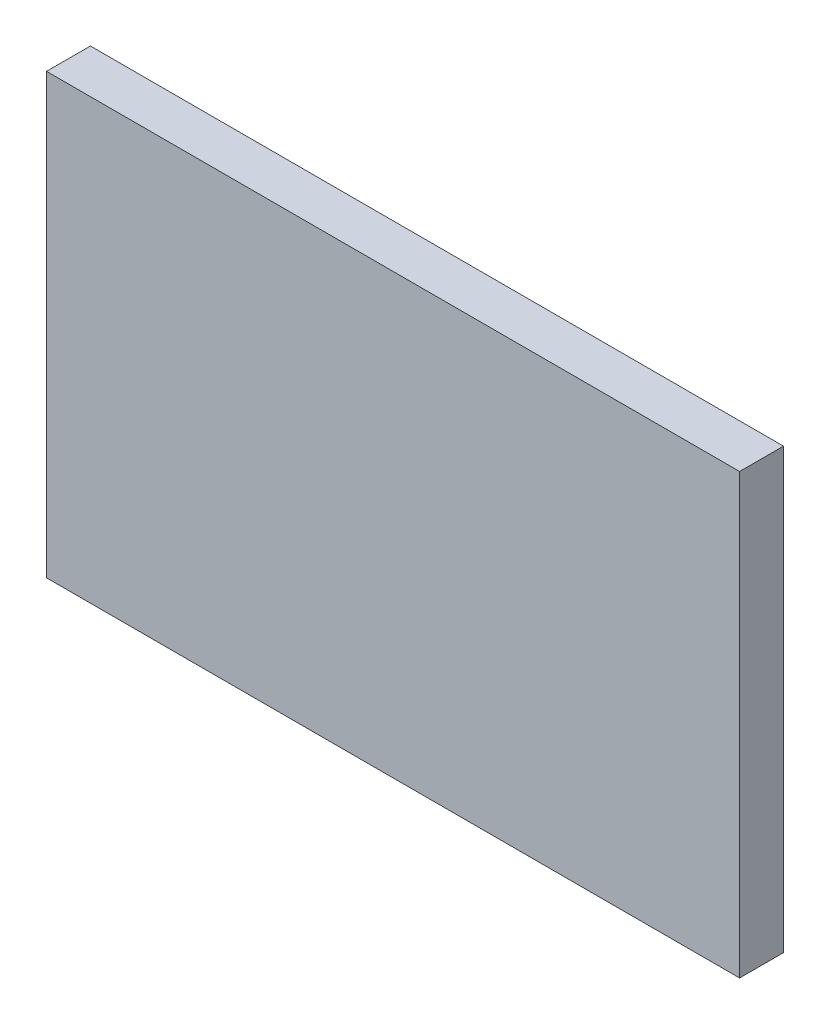
ISO-10303-21;
HEADER;
FILE_DESCRIPTION(('STEP AP214'),'2;1');
FILE_NAME('part.step','',(''),(''),'','','');
FILE_SCHEMA(('AUTOMOTIVE_DESIGN { 1 0 10303 214 1 1 1 1 }'));
ENDSEC;
DATA;
#1=APPLICATION_CONTEXT('core data for automotive mechanical design processes');
#2=APPLICATION_PROTOCOL_DEFINITION('international standard','automotive_design',2000,#1);
#3=PRODUCT_CONTEXT('',#1,'mechanical');
#4=PRODUCT('Part','Part','',(#3));
#5=PRODUCT_RELATED_PRODUCT_CATEGORY('part','',(#4));
#6=PRODUCT_DEFINITION_FORMATION('','',#4);
#7=PRODUCT_DEFINITION_CONTEXT('part definition',#1,'design');
#8=PRODUCT_DEFINITION('design','',#6,#7);
#9=PRODUCT_DEFINITION_SHAPE('','',#8);
#10=(LENGTH_UNIT() NAMED_UNIT(*) SI_UNIT(.MILLI.,.METRE.));
#11=(NAMED_UNIT(*) PLANE_ANGLE_UNIT() SI_UNIT($,.RADIAN.));
#12=(NAMED_UNIT(*) SI_UNIT($,.STERADIAN.) SOLID_ANGLE_UNIT());
#13=UNCERTAINTY_MEASURE_WITH_UNIT(LENGTH_MEASURE(1.E-05),#10,'distance_accuracy_value','');
#14=(GEOMETRIC_REPRESENTATION_CONTEXT(3) GLOBAL_UNCERTAINTY_ASSIGNED_CONTEXT((#13)) GLOBAL_UNIT_ASSIGNED_CONTEXT((#10,
#11,#12)) REPRESENTATION_CONTEXT('',''));
#15=CARTESIAN_POINT('',(0.,0.,0.));
#16=DIRECTION('',(0.,0.,1.));
#17=DIRECTION('',(1.,0.,0.));
#18=AXIS2_PLACEMENT_3D('',#15,#16,#17);
#19=CARTESIAN_POINT('',(0.,0.,100.));
#20=DIRECTION('',(1.,0.,0.));
#21=DIRECTION('',(0.,0.,-1.));
#22=AXIS2_PLACEMENT_3D('',#19,#20,#21);
#23=PLANE('',#22);
#24=DIRECTION('',(0.,-1.,0.));
#25=VECTOR('',#24,1.);
#26=CARTESIAN_POINT('',(0.,0.,0.));
#27=LINE('',#26,#25);
#28=CARTESIAN_POINT('',(0.,0.,0.));
#29=VERTEX_POINT('',#28);
#30=CARTESIAN_POINT('',(0.,-1000.,0.));
#31=VERTEX_POINT('',#30);
#32=EDGE_CURVE('E96',#29,#31,#27,.T.);
#33=ORIENTED_EDGE('',*,*,#32,.T.);
#34=DIRECTION('',(0.,0.,-1.));
#35=VECTOR('',#34,1.);
#36=CARTESIAN_POINT('',(0.,-1000.,100.));
#37=LINE('',#36,#35);
#38=CARTESIAN_POINT('',(0.,-1000.,100.));
#39=VERTEX_POINT('',#38);
#40=EDGE_CURVE('E11',#39,#31,#37,.T.);
#41=ORIENTED_EDGE('',*,*,#40,.F.);
#42=DIRECTION('',(0.,-1.,0.));
#43=VECTOR('',#42,1.);
#44=CARTESIAN_POINT('',(0.,0.,100.));
#45=LINE('',#44,#43);
#46=CARTESIAN_POINT('',(0.,0.,100.));
#47=VERTEX_POINT('',#46);
#48=EDGE_CURVE('E84',#47,#39,#45,.T.);
#49=ORIENTED_EDGE('',*,*,#48,.F.);
#50=DIRECTION('',(0.,0.,-1.));
#51=VECTOR('',#50,1.);
#52=CARTESIAN_POINT('',(0.,0.,100.));
#53=LINE('',#52,#51);
#54=EDGE_CURVE('E92',#47,#29,#53,.T.);
#55=ORIENTED_EDGE('',*,*,#54,.T.);
#56=EDGE_LOOP('',(#33,#41,#49,#55));
#57=FACE_BOUND('',#56,.T.);
#58=ADVANCED_FACE('F33',(#57),#23,.F.);
#59=CARTESIAN_POINT('',(0.,-1000.,100.));
#60=DIRECTION('',(0.,1.,0.));
#61=DIRECTION('',(0.,0.,1.));
#62=AXIS2_PLACEMENT_3D('',#59,#60,#61);
#63=PLANE('',#62);
#64=DIRECTION('',(1.,0.,0.));
#65=VECTOR('',#64,1.);
#66=CARTESIAN_POINT('',(0.,-1000.,0.));
#67=LINE('',#66,#65);
#68=CARTESIAN_POINT('',(1580.,-1000.,0.));
#69=VERTEX_POINT('',#68);
#70=EDGE_CURVE('E88',#31,#69,#67,.T.);
#71=ORIENTED_EDGE('',*,*,#70,.T.);
#72=DIRECTION('',(0.,0.,-1.));
#73=VECTOR('',#72,1.);
#74=CARTESIAN_POINT('',(1580.,-1000.,100.));
#75=LINE('',#74,#73);
#76=CARTESIAN_POINT('',(1580.,-1000.,100.));
#77=VERTEX_POINT('',#76);
#78=EDGE_CURVE('E41',#77,#69,#75,.T.);
#79=ORIENTED_EDGE('',*,*,#78,.F.);
#80=DIRECTION('',(1.,0.,0.));
#81=VECTOR('',#80,1.);
#82=CARTESIAN_POINT('',(0.,-1000.,100.));
#83=LINE('',#82,#81);
#84=EDGE_CURVE('E79',#39,#77,#83,.T.);
#85=ORIENTED_EDGE('',*,*,#84,.F.);
#86=ORIENTED_EDGE('',*,*,#40,.T.);
#87=EDGE_LOOP('',(#71,#79,#85,#86));
#88=FACE_BOUND('',#87,.T.);
#89=ADVANCED_FACE('F87',(#88),#63,.F.);
#90=CARTESIAN_POINT('',(1580.,0.,100.));
#91=DIRECTION('',(-1.,0.,0.));
#92=DIRECTION('',(0.,0.,1.));
#93=AXIS2_PLACEMENT_3D('',#90,#91,#92);
#94=PLANE('',#93);
#95=DIRECTION('',(0.,1.,0.));
#96=VECTOR('',#95,1.);
#97=CARTESIAN_POINT('',(1580.,0.,0.));
#98=LINE('',#97,#96);
#99=CARTESIAN_POINT('',(1580.,0.,0.));
#100=VERTEX_POINT('',#99);
#101=EDGE_CURVE('E66',#69,#100,#98,.T.);
#102=ORIENTED_EDGE('',*,*,#101,.T.);
#103=DIRECTION('',(0.,0.,-1.));
#104=VECTOR('',#103,1.);
#105=CARTESIAN_POINT('',(1580.,0.,100.));
#106=LINE('',#105,#104);
#107=CARTESIAN_POINT('',(1580.,0.,100.));
#108=VERTEX_POINT('',#107);
#109=EDGE_CURVE('E89',#108,#100,#106,.T.);
#110=ORIENTED_EDGE('',*,*,#109,.F.);
#111=DIRECTION('',(0.,1.,0.));
#112=VECTOR('',#111,1.);
#113=CARTESIAN_POINT('',(1580.,0.,100.));
#114=LINE('',#113,#112);
#115=EDGE_CURVE('E82',#77,#108,#114,.T.);
#116=ORIENTED_EDGE('',*,*,#115,.F.);
#117=ORIENTED_EDGE('',*,*,#78,.T.);
#118=EDGE_LOOP('',(#102,#110,#116,#117));
#119=FACE_BOUND('',#118,.T.);
#120=ADVANCED_FACE('F90',(#119),#94,.F.);
#121=CARTESIAN_POINT('',(0.,0.,100.));
#122=DIRECTION('',(0.,-1.,0.));
#123=DIRECTION('',(0.,0.,-1.));
#124=AXIS2_PLACEMENT_3D('',#121,#122,#123);
#125=PLANE('',#124);
#126=DIRECTION('',(-1.,0.,0.));
#127=VECTOR('',#126,1.);
#128=CARTESIAN_POINT('',(0.,0.,0.));
#129=LINE('',#128,#127);
#130=EDGE_CURVE('E72',#100,#29,#129,.T.);
#131=ORIENTED_EDGE('',*,*,#130,.T.);
#132=ORIENTED_EDGE('',*,*,#54,.F.);
#133=DIRECTION('',(-1.,0.,0.));
#134=VECTOR('',#133,1.);
#135=CARTESIAN_POINT('',(0.,0.,100.));
#136=LINE('',#135,#134);
#137=EDGE_CURVE('E49',#108,#47,#136,.T.);
#138=ORIENTED_EDGE('',*,*,#137,.F.);
#139=ORIENTED_EDGE('',*,*,#109,.T.);
#140=EDGE_LOOP('',(#131,#132,#138,#139));
#141=FACE_BOUND('',#140,.T.);
#142=ADVANCED_FACE('F103',(#141),#125,.F.);
#143=CARTESIAN_POINT('',(0.,0.,100.));
#144=DIRECTION('',(0.,0.,1.));
#145=DIRECTION('',(1.,0.,0.));
#146=AXIS2_PLACEMENT_3D('',#143,#144,#145);
#147=PLANE('',#146);
#148=ORIENTED_EDGE('',*,*,#48,.T.);
#149=ORIENTED_EDGE('',*,*,#84,.T.);
#150=ORIENTED_EDGE('',*,*,#115,.T.);
#151=ORIENTED_EDGE('',*,*,#137,.T.);
#152=EDGE_LOOP('',(#148,#149,#150,#151));
#153=FACE_BOUND('',#152,.T.);
#154=ADVANCED_FACE('F80',(#153),#147,.T.);
#155=CARTESIAN_POINT('',(0.,0.,0.));
#156=DIRECTION('',(0.,0.,1.));
#157=DIRECTION('',(1.,0.,0.));
#158=AXIS2_PLACEMENT_3D('',#155,#156,#157);
#159=PLANE('',#158);
#160=ORIENTED_EDGE('',*,*,#32,.F.);
#161=ORIENTED_EDGE('',*,*,#130,.F.);
#162=ORIENTED_EDGE('',*,*,#101,.F.);
#163=ORIENTED_EDGE('',*,*,#70,.F.);
#164=EDGE_LOOP('',(#160,#161,#162,#163));
#165=FACE_BOUND('',#164,.T.);
#166=ADVANCED_FACE('F106',(#165),#159,.F.);
#167=CLOSED_SHELL('',(#58,#89,#120,#142,#154,#166));
#168=MANIFOLD_SOLID_BREP('B2',#167);
#169=ADVANCED_BREP_SHAPE_REPRESENTATION('',(#18,#168),#14);
#170=SHAPE_DEFINITION_REPRESENTATION(#9,#169);
ENDSEC;
END-ISO-10303-21;
